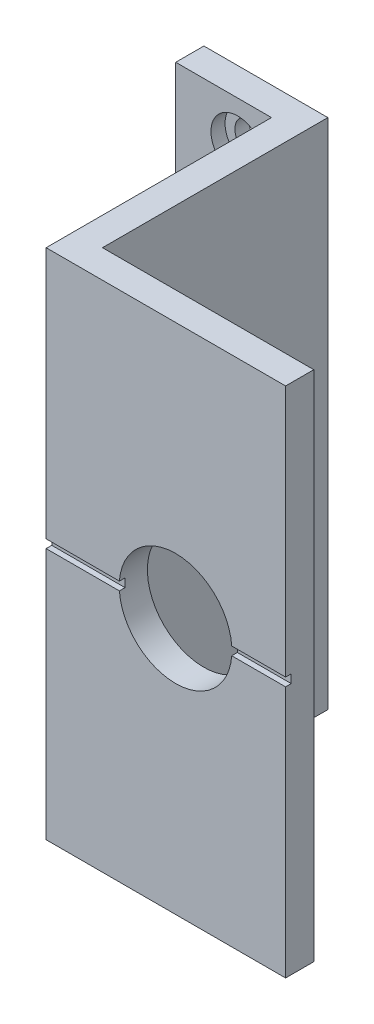
ISO-10303-21;
HEADER;
FILE_DESCRIPTION(('STEP AP214'),'2;1');
FILE_NAME('part.step','',(''),(''),'','','');
FILE_SCHEMA(('AUTOMOTIVE_DESIGN { 1 0 10303 214 1 1 1 1 }'));
ENDSEC;
DATA;
#1=APPLICATION_CONTEXT('core data for automotive mechanical design processes');
#2=APPLICATION_PROTOCOL_DEFINITION('international standard','automotive_design',2000,#1);
#3=PRODUCT_CONTEXT('',#1,'mechanical');
#4=PRODUCT('Part','Part','',(#3));
#5=PRODUCT_RELATED_PRODUCT_CATEGORY('part','',(#4));
#6=PRODUCT_DEFINITION_FORMATION('','',#4);
#7=PRODUCT_DEFINITION_CONTEXT('part definition',#1,'design');
#8=PRODUCT_DEFINITION('design','',#6,#7);
#9=PRODUCT_DEFINITION_SHAPE('','',#8);
#10=(LENGTH_UNIT() NAMED_UNIT(*) SI_UNIT(.MILLI.,.METRE.));
#11=(NAMED_UNIT(*) PLANE_ANGLE_UNIT() SI_UNIT($,.RADIAN.));
#12=(NAMED_UNIT(*) SI_UNIT($,.STERADIAN.) SOLID_ANGLE_UNIT());
#13=UNCERTAINTY_MEASURE_WITH_UNIT(LENGTH_MEASURE(1.E-05),#10,'distance_accuracy_value','');
#14=(GEOMETRIC_REPRESENTATION_CONTEXT(3) GLOBAL_UNCERTAINTY_ASSIGNED_CONTEXT((#13)) GLOBAL_UNIT_ASSIGNED_CONTEXT((#10,
#11,#12)) REPRESENTATION_CONTEXT('',''));
#15=CARTESIAN_POINT('',(0.,0.,0.));
#16=DIRECTION('',(0.,0.,1.));
#17=DIRECTION('',(1.,0.,0.));
#18=AXIS2_PLACEMENT_3D('',#15,#16,#17);
#19=CARTESIAN_POINT('',(1.26077145221769,16.9859730706249,1.));
#20=DIRECTION('',(1.,0.,0.));
#21=DIRECTION('',(0.,1.,0.));
#22=AXIS2_PLACEMENT_3D('',#19,#20,#21);
#23=PLANE('',#22);
#24=DIRECTION('',(0.,-1.,0.));
#25=VECTOR('',#24,1.);
#26=CARTESIAN_POINT('',(1.26077145221769,16.9859730706249,1.));
#27=LINE('',#26,#25);
#28=CARTESIAN_POINT('',(1.26077145221769,5.23597307062491,1.));
#29=VERTEX_POINT('',#28);
#30=CARTESIAN_POINT('',(1.26077145221769,-1.21402692937509,1.));
#31=VERTEX_POINT('',#30);
#32=EDGE_CURVE('E204',#29,#31,#27,.T.);
#33=ORIENTED_EDGE('',*,*,#32,.F.);
#34=DIRECTION('',(0.,0.,1.));
#35=VECTOR('',#34,1.);
#36=CARTESIAN_POINT('',(1.26077145221769,5.23597307062491,1.));
#37=LINE('',#36,#35);
#38=CARTESIAN_POINT('',(1.26077145221769,5.23597307062491,0.));
#39=VERTEX_POINT('',#38);
#40=EDGE_CURVE('E195',#39,#29,#37,.T.);
#41=ORIENTED_EDGE('',*,*,#40,.F.);
#42=DIRECTION('',(0.,-1.,0.));
#43=VECTOR('',#42,1.);
#44=CARTESIAN_POINT('',(1.26077145221769,16.9859730706249,0.));
#45=LINE('',#44,#43);
#46=CARTESIAN_POINT('',(1.26077145221769,-1.21402692937509,0.));
#47=VERTEX_POINT('',#46);
#48=EDGE_CURVE('E216',#39,#47,#45,.T.);
#49=ORIENTED_EDGE('',*,*,#48,.T.);
#50=DIRECTION('',(0.,0.,-1.));
#51=VECTOR('',#50,1.);
#52=CARTESIAN_POINT('',(1.26077145221769,-1.21402692937509,1.));
#53=LINE('',#52,#51);
#54=EDGE_CURVE('E228',#31,#47,#53,.T.);
#55=ORIENTED_EDGE('',*,*,#54,.F.);
#56=EDGE_LOOP('',(#33,#41,#49,#55));
#57=FACE_BOUND('',#56,.T.);
#58=ADVANCED_FACE('F32',(#57),#23,.F.);
#59=CARTESIAN_POINT('',(0.,0.,9.));
#60=DIRECTION('',(0.,0.,1.));
#61=DIRECTION('',(1.,0.,0.));
#62=AXIS2_PLACEMENT_3D('',#59,#60,#61);
#63=PLANE('',#62);
#64=DIRECTION('',(-1.,0.,0.));
#65=VECTOR('',#64,1.);
#66=CARTESIAN_POINT('',(4.66077145221769,8.03597307062482,9.));
#67=LINE('',#66,#65);
#68=CARTESIAN_POINT('',(13.1607714522177,8.03597307062483,9.));
#69=VERTEX_POINT('',#68);
#70=CARTESIAN_POINT('',(11.2492126650431,8.03597307062483,9.));
#71=VERTEX_POINT('',#70);
#72=EDGE_CURVE('E315',#69,#71,#67,.T.);
#73=ORIENTED_EDGE('',*,*,#72,.F.);
#74=DIRECTION('',(0.,1.,0.));
#75=VECTOR('',#74,1.);
#76=CARTESIAN_POINT('',(13.1607714522177,16.9859730706248,9.));
#77=LINE('',#76,#75);
#78=CARTESIAN_POINT('',(13.1607714522177,16.9859730706248,9.));
#79=VERTEX_POINT('',#78);
#80=EDGE_CURVE('E351',#69,#79,#77,.T.);
#81=ORIENTED_EDGE('',*,*,#80,.T.);
#82=DIRECTION('',(-1.,0.,0.));
#83=VECTOR('',#82,1.);
#84=CARTESIAN_POINT('',(4.66077145221769,16.9859730706249,9.));
#85=LINE('',#84,#83);
#86=CARTESIAN_POINT('',(4.66077145221769,16.9859730706249,9.));
#87=VERTEX_POINT('',#86);
#88=EDGE_CURVE('E355',#79,#87,#85,.T.);
#89=ORIENTED_EDGE('',*,*,#88,.T.);
#90=DIRECTION('',(0.,-1.,0.));
#91=VECTOR('',#90,1.);
#92=CARTESIAN_POINT('',(4.66077145221769,16.9859730706249,9.));
#93=LINE('',#92,#91);
#94=CARTESIAN_POINT('',(4.66077145221769,8.03597307062482,9.));
#95=VERTEX_POINT('',#94);
#96=EDGE_CURVE('E345',#87,#95,#93,.T.);
#97=ORIENTED_EDGE('',*,*,#96,.T.);
#98=CARTESIAN_POINT('',(7.26047853000731,8.03597307062483,9.));
#99=VERTEX_POINT('',#98);
#100=EDGE_CURVE('E326',#99,#95,#67,.T.);
#101=ORIENTED_EDGE('',*,*,#100,.F.);
#102=CARTESIAN_POINT('',(9.25484559752519,7.88597307062491,9.));
#103=DIRECTION('',(0.,0.,1.));
#104=DIRECTION('',(1.,0.,0.));
#105=AXIS2_PLACEMENT_3D('',#102,#103,#104);
#106=CIRCLE('',#105,1.99999999999996);
#107=EDGE_CURVE('E338',#71,#99,#106,.T.);
#108=ORIENTED_EDGE('',*,*,#107,.F.);
#109=EDGE_LOOP('',(#73,#81,#89,#97,#101,#108));
#110=FACE_BOUND('',#109,.T.);
#111=ADVANCED_FACE('F429',(#110),#63,.T.);
#112=CARTESIAN_POINT('',(1.26077145221769,16.9859730706249,0.));
#113=VERTEX_POINT('',#112);
#114=CARTESIAN_POINT('',(1.26077145221769,10.5359730706249,0.));
#115=VERTEX_POINT('',#114);
#116=EDGE_CURVE('E194',#113,#115,#45,.T.);
#117=ORIENTED_EDGE('',*,*,#116,.T.);
#118=DIRECTION('',(0.,0.,-1.));
#119=VECTOR('',#118,1.);
#120=CARTESIAN_POINT('',(1.26077145221769,10.5359730706249,0.));
#121=LINE('',#120,#119);
#122=CARTESIAN_POINT('',(1.26077145221769,10.5359730706249,1.));
#123=VERTEX_POINT('',#122);
#124=EDGE_CURVE('E180',#123,#115,#121,.T.);
#125=ORIENTED_EDGE('',*,*,#124,.F.);
#126=CARTESIAN_POINT('',(1.26077145221769,16.9859730706249,1.));
#127=VERTEX_POINT('',#126);
#128=EDGE_CURVE('E192',#127,#123,#27,.T.);
#129=ORIENTED_EDGE('',*,*,#128,.F.);
#130=DIRECTION('',(0.,0.,-1.));
#131=VECTOR('',#130,1.);
#132=CARTESIAN_POINT('',(1.26077145221769,16.9859730706249,1.));
#133=LINE('',#132,#131);
#134=EDGE_CURVE('E213',#127,#113,#133,.T.);
#135=ORIENTED_EDGE('',*,*,#134,.T.);
#136=EDGE_LOOP('',(#117,#125,#129,#135));
#137=FACE_BOUND('',#136,.T.);
#138=ADVANCED_FACE('F190',(#137),#23,.F.);
#139=CARTESIAN_POINT('',(1.26077145221769,-1.21402692937509,1.));
#140=DIRECTION('',(0.,1.,0.));
#141=DIRECTION('',(0.,0.,1.));
#142=AXIS2_PLACEMENT_3D('',#139,#140,#141);
#143=PLANE('',#142);
#144=DIRECTION('',(1.,0.,0.));
#145=VECTOR('',#144,1.);
#146=CARTESIAN_POINT('',(1.26077145221769,-1.21402692937509,0.));
#147=LINE('',#146,#145);
#148=CARTESIAN_POINT('',(5.66077145221769,-1.21402692937509,0.));
#149=VERTEX_POINT('',#148);
#150=EDGE_CURVE('E215',#47,#149,#147,.T.);
#151=ORIENTED_EDGE('',*,*,#150,.T.);
#152=DIRECTION('',(0.,0.,-1.));
#153=VECTOR('',#152,1.);
#154=CARTESIAN_POINT('',(5.66077145221769,-1.21402692937509,1.));
#155=LINE('',#154,#153);
#156=CARTESIAN_POINT('',(5.66077145221769,-1.21402692937509,8.));
#157=VERTEX_POINT('',#156);
#158=EDGE_CURVE('E225',#157,#149,#155,.T.);
#159=ORIENTED_EDGE('',*,*,#158,.F.);
#160=DIRECTION('',(1.,0.,0.));
#161=VECTOR('',#160,1.);
#162=CARTESIAN_POINT('',(4.66077145221769,-1.21402692937509,8.));
#163=LINE('',#162,#161);
#164=CARTESIAN_POINT('',(13.1607714522177,-1.21402692937517,8.));
#165=VERTEX_POINT('',#164);
#166=EDGE_CURVE('E341',#157,#165,#163,.T.);
#167=ORIENTED_EDGE('',*,*,#166,.T.);
#168=DIRECTION('',(0.,0.,-1.));
#169=VECTOR('',#168,1.);
#170=CARTESIAN_POINT('',(13.1607714522177,-1.21402692937517,9.));
#171=LINE('',#170,#169);
#172=CARTESIAN_POINT('',(13.1607714522177,-1.21402692937517,9.));
#173=VERTEX_POINT('',#172);
#174=EDGE_CURVE('E367',#173,#165,#171,.T.);
#175=ORIENTED_EDGE('',*,*,#174,.F.);
#176=DIRECTION('',(1.,0.,0.));
#177=VECTOR('',#176,1.);
#178=CARTESIAN_POINT('',(4.66077145221769,-1.21402692937509,9.));
#179=LINE('',#178,#177);
#180=CARTESIAN_POINT('',(4.66077145221769,-1.21402692937509,9.));
#181=VERTEX_POINT('',#180);
#182=EDGE_CURVE('E348',#181,#173,#179,.T.);
#183=ORIENTED_EDGE('',*,*,#182,.F.);
#184=DIRECTION('',(0.,0.,-1.));
#185=VECTOR('',#184,1.);
#186=CARTESIAN_POINT('',(4.6607714522177,-1.21402692937509,8.));
#187=LINE('',#186,#185);
#188=CARTESIAN_POINT('',(4.6607714522177,-1.21402692937509,1.));
#189=VERTEX_POINT('',#188);
#190=EDGE_CURVE('E379',#181,#189,#187,.T.);
#191=ORIENTED_EDGE('',*,*,#190,.T.);
#192=DIRECTION('',(1.,0.,0.));
#193=VECTOR('',#192,1.);
#194=CARTESIAN_POINT('',(1.26077145221769,-1.21402692937509,1.));
#195=LINE('',#194,#193);
#196=EDGE_CURVE('E203',#31,#189,#195,.T.);
#197=ORIENTED_EDGE('',*,*,#196,.F.);
#198=ORIENTED_EDGE('',*,*,#54,.T.);
#199=EDGE_LOOP('',(#151,#159,#167,#175,#183,#191,#197,#198));
#200=FACE_BOUND('',#199,.T.);
#201=ADVANCED_FACE('F440',(#200),#143,.F.);
#202=CARTESIAN_POINT('',(5.66077145221769,16.9859730706249,1.));
#203=DIRECTION('',(-1.,0.,0.));
#204=DIRECTION('',(0.,-1.,0.));
#205=AXIS2_PLACEMENT_3D('',#202,#203,#204);
#206=PLANE('',#205);
#207=DIRECTION('',(0.,1.,0.));
#208=VECTOR('',#207,1.);
#209=CARTESIAN_POINT('',(5.66077145221769,16.9859730706249,0.));
#210=LINE('',#209,#208);
#211=CARTESIAN_POINT('',(5.66077145221769,16.9859730706249,0.));
#212=VERTEX_POINT('',#211);
#213=EDGE_CURVE('E218',#149,#212,#210,.T.);
#214=ORIENTED_EDGE('',*,*,#213,.T.);
#215=DIRECTION('',(0.,0.,-1.));
#216=VECTOR('',#215,1.);
#217=CARTESIAN_POINT('',(5.66077145221769,16.9859730706249,1.));
#218=LINE('',#217,#216);
#219=CARTESIAN_POINT('',(5.66077145221769,16.9859730706249,8.));
#220=VERTEX_POINT('',#219);
#221=EDGE_CURVE('E222',#220,#212,#218,.T.);
#222=ORIENTED_EDGE('',*,*,#221,.F.);
#223=DIRECTION('',(0.,1.,0.));
#224=VECTOR('',#223,1.);
#225=CARTESIAN_POINT('',(5.66077145221769,16.9859730706249,8.));
#226=LINE('',#225,#224);
#227=EDGE_CURVE('E371',#157,#220,#226,.T.);
#228=ORIENTED_EDGE('',*,*,#227,.F.);
#229=ORIENTED_EDGE('',*,*,#158,.T.);
#230=EDGE_LOOP('',(#214,#222,#228,#229));
#231=FACE_BOUND('',#230,.T.);
#232=ADVANCED_FACE('F444',(#231),#206,.F.);
#233=CARTESIAN_POINT('',(1.26077145221769,16.9859730706249,1.));
#234=DIRECTION('',(0.,-1.,0.));
#235=DIRECTION('',(0.,0.,-1.));
#236=AXIS2_PLACEMENT_3D('',#233,#234,#235);
#237=PLANE('',#236);
#238=DIRECTION('',(-1.,0.,0.));
#239=VECTOR('',#238,1.);
#240=CARTESIAN_POINT('',(1.26077145221769,16.9859730706249,0.));
#241=LINE('',#240,#239);
#242=EDGE_CURVE('E207',#212,#113,#241,.T.);
#243=ORIENTED_EDGE('',*,*,#242,.T.);
#244=ORIENTED_EDGE('',*,*,#134,.F.);
#245=DIRECTION('',(-1.,0.,0.));
#246=VECTOR('',#245,1.);
#247=CARTESIAN_POINT('',(1.26077145221769,16.9859730706249,1.));
#248=LINE('',#247,#246);
#249=CARTESIAN_POINT('',(4.66077145221769,16.9859730706249,1.));
#250=VERTEX_POINT('',#249);
#251=EDGE_CURVE('E201',#250,#127,#248,.T.);
#252=ORIENTED_EDGE('',*,*,#251,.F.);
#253=DIRECTION('',(0.,0.,-1.));
#254=VECTOR('',#253,1.);
#255=CARTESIAN_POINT('',(4.66077145221769,16.9859730706249,8.));
#256=LINE('',#255,#254);
#257=EDGE_CURVE('E374',#87,#250,#256,.T.);
#258=ORIENTED_EDGE('',*,*,#257,.F.);
#259=ORIENTED_EDGE('',*,*,#88,.F.);
#260=DIRECTION('',(0.,0.,-1.));
#261=VECTOR('',#260,1.);
#262=CARTESIAN_POINT('',(13.1607714522177,16.9859730706248,9.));
#263=LINE('',#262,#261);
#264=CARTESIAN_POINT('',(13.1607714522177,16.9859730706248,8.));
#265=VERTEX_POINT('',#264);
#266=EDGE_CURVE('E358',#79,#265,#263,.T.);
#267=ORIENTED_EDGE('',*,*,#266,.T.);
#268=DIRECTION('',(-1.,0.,0.));
#269=VECTOR('',#268,1.);
#270=CARTESIAN_POINT('',(4.66077145221769,16.9859730706249,8.));
#271=LINE('',#270,#269);
#272=EDGE_CURVE('E362',#265,#220,#271,.T.);
#273=ORIENTED_EDGE('',*,*,#272,.T.);
#274=ORIENTED_EDGE('',*,*,#221,.T.);
#275=EDGE_LOOP('',(#243,#244,#252,#258,#259,#267,#273,#274));
#276=FACE_BOUND('',#275,.T.);
#277=ADVANCED_FACE('F410',(#276),#237,.F.);
#278=CARTESIAN_POINT('',(0.,0.,1.));
#279=DIRECTION('',(0.,0.,1.));
#280=DIRECTION('',(1.,0.,0.));
#281=AXIS2_PLACEMENT_3D('',#278,#279,#280);
#282=PLANE('',#281);
#283=DIRECTION('',(0.,1.,0.));
#284=VECTOR('',#283,1.);
#285=CARTESIAN_POINT('',(3.26077145221769,10.5359730706249,1.));
#286=LINE('',#285,#284);
#287=CARTESIAN_POINT('',(3.26077145221769,5.73597307062491,1.));
#288=VERTEX_POINT('',#287);
#289=CARTESIAN_POINT('',(3.26077145221769,10.0359730706249,1.));
#290=VERTEX_POINT('',#289);
#291=EDGE_CURVE('E271',#288,#290,#286,.T.);
#292=ORIENTED_EDGE('',*,*,#291,.F.);
#293=CARTESIAN_POINT('',(2.76077145221769,5.73597307062491,1.));
#294=DIRECTION('',(0.,0.,1.));
#295=DIRECTION('',(1.,0.,0.));
#296=AXIS2_PLACEMENT_3D('',#293,#294,#295);
#297=CIRCLE('',#296,0.5);
#298=CARTESIAN_POINT('',(2.76077145221769,5.23597307062491,1.));
#299=VERTEX_POINT('',#298);
#300=EDGE_CURVE('E254',#288,#299,#297,.F.);
#301=ORIENTED_EDGE('',*,*,#300,.T.);
#302=DIRECTION('',(-1.,0.,0.));
#303=VECTOR('',#302,1.);
#304=CARTESIAN_POINT('',(3.26077145221769,5.23597307062491,1.));
#305=LINE('',#304,#303);
#306=EDGE_CURVE('E275',#299,#29,#305,.T.);
#307=ORIENTED_EDGE('',*,*,#306,.T.);
#308=ORIENTED_EDGE('',*,*,#32,.T.);
#309=ORIENTED_EDGE('',*,*,#196,.T.);
#310=DIRECTION('',(0.,-1.,0.));
#311=VECTOR('',#310,1.);
#312=CARTESIAN_POINT('',(4.66077145221769,16.9859730706249,1.));
#313=LINE('',#312,#311);
#314=EDGE_CURVE('E370',#250,#189,#313,.T.);
#315=ORIENTED_EDGE('',*,*,#314,.F.);
#316=ORIENTED_EDGE('',*,*,#251,.T.);
#317=ORIENTED_EDGE('',*,*,#128,.T.);
#318=DIRECTION('',(-1.,0.,0.));
#319=VECTOR('',#318,1.);
#320=CARTESIAN_POINT('',(3.26077145221769,10.5359730706249,1.));
#321=LINE('',#320,#319);
#322=CARTESIAN_POINT('',(2.76077145221769,10.5359730706249,1.));
#323=VERTEX_POINT('',#322);
#324=EDGE_CURVE('E177',#323,#123,#321,.T.);
#325=ORIENTED_EDGE('',*,*,#324,.F.);
#326=CARTESIAN_POINT('',(2.76077145221769,10.0359730706249,1.));
#327=DIRECTION('',(0.,0.,1.));
#328=DIRECTION('',(1.,0.,0.));
#329=AXIS2_PLACEMENT_3D('',#326,#327,#328);
#330=CIRCLE('',#329,0.5);
#331=EDGE_CURVE('E11',#323,#290,#330,.F.);
#332=ORIENTED_EDGE('',*,*,#331,.T.);
#333=EDGE_LOOP('',(#292,#301,#307,#308,#309,#315,#316,#317,#325,#332));
#334=FACE_BOUND('',#333,.T.);
#335=CARTESIAN_POINT('',(3.46077145221769,15.4859730706249,1.));
#336=DIRECTION('',(0.,0.,1.));
#337=DIRECTION('',(1.,0.,0.));
#338=AXIS2_PLACEMENT_3D('',#335,#336,#337);
#339=CIRCLE('',#338,0.950000000000001);
#340=CARTESIAN_POINT('',(4.41077145221769,15.4859730706249,1.));
#341=VERTEX_POINT('',#340);
#342=EDGE_CURVE('E386',#341,#341,#339,.T.);
#343=ORIENTED_EDGE('',*,*,#342,.F.);
#344=EDGE_LOOP('',(#343));
#345=FACE_BOUND('',#344,.T.);
#346=CARTESIAN_POINT('',(3.46077145221769,2.78597307062491,1.));
#347=DIRECTION('',(0.,0.,1.));
#348=DIRECTION('',(1.,0.,0.));
#349=AXIS2_PLACEMENT_3D('',#346,#347,#348);
#350=CIRCLE('',#349,0.95);
#351=CARTESIAN_POINT('',(4.41077145221769,2.78597307062491,1.));
#352=VERTEX_POINT('',#351);
#353=EDGE_CURVE('E382',#352,#352,#350,.T.);
#354=ORIENTED_EDGE('',*,*,#353,.F.);
#355=EDGE_LOOP('',(#354));
#356=FACE_BOUND('',#355,.T.);
#357=CARTESIAN_POINT('',(3.46077145221769,12.9859730706249,1.));
#358=DIRECTION('',(0.,0.,1.));
#359=DIRECTION('',(1.,0.,0.));
#360=AXIS2_PLACEMENT_3D('',#357,#358,#359);
#361=CIRCLE('',#360,0.949999999999999);
#362=CARTESIAN_POINT('',(4.41077145221769,12.9859730706249,1.));
#363=VERTEX_POINT('',#362);
#364=EDGE_CURVE('E209',#363,#363,#361,.T.);
#365=ORIENTED_EDGE('',*,*,#364,.F.);
#366=EDGE_LOOP('',(#365));
#367=FACE_BOUND('',#366,.T.);
#368=CARTESIAN_POINT('',(3.46077145221769,0.285973070624914,1.));
#369=DIRECTION('',(0.,0.,1.));
#370=DIRECTION('',(1.,0.,0.));
#371=AXIS2_PLACEMENT_3D('',#368,#369,#370);
#372=CIRCLE('',#371,0.95);
#373=CARTESIAN_POINT('',(4.41077145221769,0.285973070624914,1.));
#374=VERTEX_POINT('',#373);
#375=EDGE_CURVE('E397',#374,#374,#372,.T.);
#376=ORIENTED_EDGE('',*,*,#375,.F.);
#377=EDGE_LOOP('',(#376));
#378=FACE_BOUND('',#377,.T.);
#379=ADVANCED_FACE('F198',(#334,#345,#356,#367,#378),#282,.T.);
#380=CARTESIAN_POINT('',(0.,0.,0.));
#381=DIRECTION('',(0.,0.,1.));
#382=DIRECTION('',(1.,0.,0.));
#383=AXIS2_PLACEMENT_3D('',#380,#381,#382);
#384=PLANE('',#383);
#385=ORIENTED_EDGE('',*,*,#48,.F.);
#386=DIRECTION('',(-1.,0.,0.));
#387=VECTOR('',#386,1.);
#388=CARTESIAN_POINT('',(3.26077145221769,5.23597307062491,0.));
#389=LINE('',#388,#387);
#390=CARTESIAN_POINT('',(2.76077145221769,5.23597307062491,0.));
#391=VERTEX_POINT('',#390);
#392=EDGE_CURVE('E263',#391,#39,#389,.T.);
#393=ORIENTED_EDGE('',*,*,#392,.F.);
#394=CARTESIAN_POINT('',(2.76077145221769,5.73597307062491,0.));
#395=DIRECTION('',(0.,0.,1.));
#396=DIRECTION('',(1.,0.,0.));
#397=AXIS2_PLACEMENT_3D('',#394,#395,#396);
#398=CIRCLE('',#397,0.5);
#399=CARTESIAN_POINT('',(3.26077145221769,5.73597307062491,0.));
#400=VERTEX_POINT('',#399);
#401=EDGE_CURVE('E256',#391,#400,#398,.T.);
#402=ORIENTED_EDGE('',*,*,#401,.T.);
#403=DIRECTION('',(0.,-1.,0.));
#404=VECTOR('',#403,1.);
#405=CARTESIAN_POINT('',(3.26077145221769,10.5359730706249,0.));
#406=LINE('',#405,#404);
#407=CARTESIAN_POINT('',(3.26077145221769,10.0359730706249,0.));
#408=VERTEX_POINT('',#407);
#409=EDGE_CURVE('E186',#408,#400,#406,.T.);
#410=ORIENTED_EDGE('',*,*,#409,.F.);
#411=CARTESIAN_POINT('',(2.76077145221769,10.0359730706249,0.));
#412=DIRECTION('',(0.,0.,1.));
#413=DIRECTION('',(1.,0.,0.));
#414=AXIS2_PLACEMENT_3D('',#411,#412,#413);
#415=CIRCLE('',#414,0.5);
#416=CARTESIAN_POINT('',(2.76077145221769,10.5359730706249,0.));
#417=VERTEX_POINT('',#416);
#418=EDGE_CURVE('E40',#408,#417,#415,.T.);
#419=ORIENTED_EDGE('',*,*,#418,.T.);
#420=DIRECTION('',(-1.,0.,0.));
#421=VECTOR('',#420,1.);
#422=CARTESIAN_POINT('',(3.26077145221769,10.5359730706249,0.));
#423=LINE('',#422,#421);
#424=EDGE_CURVE('E185',#417,#115,#423,.T.);
#425=ORIENTED_EDGE('',*,*,#424,.T.);
#426=ORIENTED_EDGE('',*,*,#116,.F.);
#427=ORIENTED_EDGE('',*,*,#242,.F.);
#428=ORIENTED_EDGE('',*,*,#213,.F.);
#429=ORIENTED_EDGE('',*,*,#150,.F.);
#430=EDGE_LOOP('',(#385,#393,#402,#410,#419,#425,#426,#427,#428,#429));
#431=FACE_BOUND('',#430,.T.);
#432=CARTESIAN_POINT('',(3.46077145221769,15.4859730706249,0.));
#433=DIRECTION('',(0.,0.,1.));
#434=DIRECTION('',(1.,0.,0.));
#435=AXIS2_PLACEMENT_3D('',#432,#433,#434);
#436=CIRCLE('',#435,0.600000000000001);
#437=CARTESIAN_POINT('',(4.06077145221769,15.4859730706249,0.));
#438=VERTEX_POINT('',#437);
#439=EDGE_CURVE('E290',#438,#438,#436,.T.);
#440=ORIENTED_EDGE('',*,*,#439,.T.);
#441=EDGE_LOOP('',(#440));
#442=FACE_BOUND('',#441,.T.);
#443=CARTESIAN_POINT('',(3.46077145221769,12.9859730706249,0.));
#444=DIRECTION('',(0.,0.,1.));
#445=DIRECTION('',(1.,0.,0.));
#446=AXIS2_PLACEMENT_3D('',#443,#444,#445);
#447=CIRCLE('',#446,0.6);
#448=CARTESIAN_POINT('',(4.06077145221769,12.9859730706249,0.));
#449=VERTEX_POINT('',#448);
#450=EDGE_CURVE('E297',#449,#449,#447,.T.);
#451=ORIENTED_EDGE('',*,*,#450,.T.);
#452=EDGE_LOOP('',(#451));
#453=FACE_BOUND('',#452,.T.);
#454=CARTESIAN_POINT('',(3.46077145221769,2.78597307062491,0.));
#455=DIRECTION('',(0.,0.,1.));
#456=DIRECTION('',(1.,0.,0.));
#457=AXIS2_PLACEMENT_3D('',#454,#455,#456);
#458=CIRCLE('',#457,0.6);
#459=CARTESIAN_POINT('',(4.06077145221769,2.78597307062491,0.));
#460=VERTEX_POINT('',#459);
#461=EDGE_CURVE('E303',#460,#460,#458,.T.);
#462=ORIENTED_EDGE('',*,*,#461,.T.);
#463=EDGE_LOOP('',(#462));
#464=FACE_BOUND('',#463,.T.);
#465=CARTESIAN_POINT('',(3.46077145221769,0.285973070624914,0.));
#466=DIRECTION('',(0.,0.,1.));
#467=DIRECTION('',(1.,0.,0.));
#468=AXIS2_PLACEMENT_3D('',#465,#466,#467);
#469=CIRCLE('',#468,0.6);
#470=CARTESIAN_POINT('',(4.06077145221769,0.285973070624914,0.));
#471=VERTEX_POINT('',#470);
#472=EDGE_CURVE('E284',#471,#471,#469,.T.);
#473=ORIENTED_EDGE('',*,*,#472,.T.);
#474=EDGE_LOOP('',(#473));
#475=FACE_BOUND('',#474,.T.);
#476=ADVANCED_FACE('F261',(#431,#442,#453,#464,#475),#384,.F.);
#477=CARTESIAN_POINT('',(3.46077145221769,0.285973070624914,0.5));
#478=DIRECTION('',(0.,0.,1.));
#479=DIRECTION('',(1.,0.,0.));
#480=AXIS2_PLACEMENT_3D('',#477,#478,#479);
#481=CYLINDRICAL_SURFACE('',#480,0.95);
#482=CARTESIAN_POINT('',(3.46077145221769,0.285973070624914,0.5));
#483=DIRECTION('',(0.,0.,1.));
#484=DIRECTION('',(1.,0.,0.));
#485=AXIS2_PLACEMENT_3D('',#482,#483,#484);
#486=CIRCLE('',#485,0.95);
#487=CARTESIAN_POINT('',(4.41077145221769,0.285973070624914,0.5));
#488=VERTEX_POINT('',#487);
#489=EDGE_CURVE('E389',#488,#488,#486,.T.);
#490=ORIENTED_EDGE('',*,*,#489,.F.);
#491=EDGE_LOOP('',(#490));
#492=FACE_BOUND('',#491,.T.);
#493=ORIENTED_EDGE('',*,*,#375,.T.);
#494=EDGE_LOOP('',(#493));
#495=FACE_BOUND('',#494,.T.);
#496=ADVANCED_FACE('F414',(#492,#495),#481,.F.);
#497=CARTESIAN_POINT('',(3.46077145221769,0.285973070624914,0.5));
#498=DIRECTION('',(0.,0.,1.));
#499=DIRECTION('',(1.,0.,0.));
#500=AXIS2_PLACEMENT_3D('',#497,#498,#499);
#501=PLANE('',#500);
#502=CARTESIAN_POINT('',(3.46077145221769,0.285973070624914,0.5));
#503=DIRECTION('',(0.,0.,1.));
#504=DIRECTION('',(1.,0.,0.));
#505=AXIS2_PLACEMENT_3D('',#502,#503,#504);
#506=CIRCLE('',#505,0.6);
#507=CARTESIAN_POINT('',(4.06077145221769,0.285973070624914,0.5));
#508=VERTEX_POINT('',#507);
#509=EDGE_CURVE('E281',#508,#508,#506,.T.);
#510=ORIENTED_EDGE('',*,*,#509,.F.);
#511=EDGE_LOOP('',(#510));
#512=FACE_BOUND('',#511,.T.);
#513=ORIENTED_EDGE('',*,*,#489,.T.);
#514=EDGE_LOOP('',(#513));
#515=FACE_BOUND('',#514,.T.);
#516=ADVANCED_FACE('F416',(#512,#515),#501,.T.);
#517=CARTESIAN_POINT('',(3.46077145221769,12.9859730706249,0.5));
#518=DIRECTION('',(0.,0.,1.));
#519=DIRECTION('',(1.,0.,0.));
#520=AXIS2_PLACEMENT_3D('',#517,#518,#519);
#521=CYLINDRICAL_SURFACE('',#520,0.949999999999999);
#522=CARTESIAN_POINT('',(3.46077145221769,12.9859730706249,0.5));
#523=DIRECTION('',(0.,0.,1.));
#524=DIRECTION('',(1.,0.,0.));
#525=AXIS2_PLACEMENT_3D('',#522,#523,#524);
#526=CIRCLE('',#525,0.949999999999999);
#527=CARTESIAN_POINT('',(4.41077145221769,12.9859730706249,0.5));
#528=VERTEX_POINT('',#527);
#529=EDGE_CURVE('E399',#528,#528,#526,.T.);
#530=ORIENTED_EDGE('',*,*,#529,.F.);
#531=EDGE_LOOP('',(#530));
#532=FACE_BOUND('',#531,.T.);
#533=ORIENTED_EDGE('',*,*,#364,.T.);
#534=EDGE_LOOP('',(#533));
#535=FACE_BOUND('',#534,.T.);
#536=ADVANCED_FACE('F406',(#532,#535),#521,.F.);
#537=CARTESIAN_POINT('',(3.46077145221769,12.9859730706249,0.5));
#538=DIRECTION('',(0.,0.,1.));
#539=DIRECTION('',(1.,0.,0.));
#540=AXIS2_PLACEMENT_3D('',#537,#538,#539);
#541=PLANE('',#540);
#542=CARTESIAN_POINT('',(3.46077145221769,12.9859730706249,0.5));
#543=DIRECTION('',(0.,0.,1.));
#544=DIRECTION('',(1.,0.,0.));
#545=AXIS2_PLACEMENT_3D('',#542,#543,#544);
#546=CIRCLE('',#545,0.6);
#547=CARTESIAN_POINT('',(4.06077145221769,12.9859730706249,0.5));
#548=VERTEX_POINT('',#547);
#549=EDGE_CURVE('E300',#548,#548,#546,.T.);
#550=ORIENTED_EDGE('',*,*,#549,.F.);
#551=EDGE_LOOP('',(#550));
#552=FACE_BOUND('',#551,.T.);
#553=ORIENTED_EDGE('',*,*,#529,.T.);
#554=EDGE_LOOP('',(#553));
#555=FACE_BOUND('',#554,.T.);
#556=ADVANCED_FACE('F456',(#552,#555),#541,.T.);
#557=CARTESIAN_POINT('',(3.46077145221769,2.78597307062491,0.5));
#558=DIRECTION('',(0.,0.,1.));
#559=DIRECTION('',(1.,0.,0.));
#560=AXIS2_PLACEMENT_3D('',#557,#558,#559);
#561=CYLINDRICAL_SURFACE('',#560,0.95);
#562=CARTESIAN_POINT('',(3.46077145221769,2.78597307062491,0.5));
#563=DIRECTION('',(0.,0.,1.));
#564=DIRECTION('',(1.,0.,0.));
#565=AXIS2_PLACEMENT_3D('',#562,#563,#564);
#566=CIRCLE('',#565,0.95);
#567=CARTESIAN_POINT('',(4.41077145221769,2.78597307062491,0.5));
#568=VERTEX_POINT('',#567);
#569=EDGE_CURVE('E390',#568,#568,#566,.T.);
#570=ORIENTED_EDGE('',*,*,#569,.F.);
#571=EDGE_LOOP('',(#570));
#572=FACE_BOUND('',#571,.T.);
#573=ORIENTED_EDGE('',*,*,#353,.T.);
#574=EDGE_LOOP('',(#573));
#575=FACE_BOUND('',#574,.T.);
#576=ADVANCED_FACE('F459',(#572,#575),#561,.F.);
#577=CARTESIAN_POINT('',(3.46077145221769,2.78597307062491,0.5));
#578=DIRECTION('',(0.,0.,1.));
#579=DIRECTION('',(1.,0.,0.));
#580=AXIS2_PLACEMENT_3D('',#577,#578,#579);
#581=PLANE('',#580);
#582=CARTESIAN_POINT('',(3.46077145221769,2.78597307062491,0.5));
#583=DIRECTION('',(0.,0.,1.));
#584=DIRECTION('',(1.,0.,0.));
#585=AXIS2_PLACEMENT_3D('',#582,#583,#584);
#586=CIRCLE('',#585,0.6);
#587=CARTESIAN_POINT('',(4.06077145221769,2.78597307062491,0.5));
#588=VERTEX_POINT('',#587);
#589=EDGE_CURVE('E306',#588,#588,#586,.T.);
#590=ORIENTED_EDGE('',*,*,#589,.F.);
#591=EDGE_LOOP('',(#590));
#592=FACE_BOUND('',#591,.T.);
#593=ORIENTED_EDGE('',*,*,#569,.T.);
#594=EDGE_LOOP('',(#593));
#595=FACE_BOUND('',#594,.T.);
#596=ADVANCED_FACE('F464',(#592,#595),#581,.T.);
#597=CARTESIAN_POINT('',(3.46077145221769,15.4859730706249,0.5));
#598=DIRECTION('',(0.,0.,1.));
#599=DIRECTION('',(1.,0.,0.));
#600=AXIS2_PLACEMENT_3D('',#597,#598,#599);
#601=CYLINDRICAL_SURFACE('',#600,0.950000000000001);
#602=CARTESIAN_POINT('',(3.46077145221769,15.4859730706249,0.5));
#603=DIRECTION('',(0.,0.,1.));
#604=DIRECTION('',(1.,0.,0.));
#605=AXIS2_PLACEMENT_3D('',#602,#603,#604);
#606=CIRCLE('',#605,0.950000000000001);
#607=CARTESIAN_POINT('',(4.41077145221769,15.4859730706249,0.5));
#608=VERTEX_POINT('',#607);
#609=EDGE_CURVE('E383',#608,#608,#606,.T.);
#610=ORIENTED_EDGE('',*,*,#609,.F.);
#611=EDGE_LOOP('',(#610));
#612=FACE_BOUND('',#611,.T.);
#613=ORIENTED_EDGE('',*,*,#342,.T.);
#614=EDGE_LOOP('',(#613));
#615=FACE_BOUND('',#614,.T.);
#616=ADVANCED_FACE('F526',(#612,#615),#601,.F.);
#617=CARTESIAN_POINT('',(3.46077145221769,15.4859730706249,0.5));
#618=DIRECTION('',(0.,0.,1.));
#619=DIRECTION('',(1.,0.,0.));
#620=AXIS2_PLACEMENT_3D('',#617,#618,#619);
#621=PLANE('',#620);
#622=CARTESIAN_POINT('',(3.46077145221769,15.4859730706249,0.5));
#623=DIRECTION('',(0.,0.,1.));
#624=DIRECTION('',(1.,0.,0.));
#625=AXIS2_PLACEMENT_3D('',#622,#623,#624);
#626=CIRCLE('',#625,0.600000000000001);
#627=CARTESIAN_POINT('',(4.06077145221769,15.4859730706249,0.5));
#628=VERTEX_POINT('',#627);
#629=EDGE_CURVE('E294',#628,#628,#626,.T.);
#630=ORIENTED_EDGE('',*,*,#629,.F.);
#631=EDGE_LOOP('',(#630));
#632=FACE_BOUND('',#631,.T.);
#633=ORIENTED_EDGE('',*,*,#609,.T.);
#634=EDGE_LOOP('',(#633));
#635=FACE_BOUND('',#634,.T.);
#636=ADVANCED_FACE('F522',(#632,#635),#621,.T.);
#637=CARTESIAN_POINT('',(4.66077145221769,16.9859730706249,8.));
#638=DIRECTION('',(1.,0.,0.));
#639=DIRECTION('',(0.,1.,0.));
#640=AXIS2_PLACEMENT_3D('',#637,#638,#639);
#641=PLANE('',#640);
#642=DIRECTION('',(0.,-1.,0.));
#643=VECTOR('',#642,1.);
#644=CARTESIAN_POINT('',(4.66077145221769,8.03597307062482,8.8));
#645=LINE('',#644,#643);
#646=CARTESIAN_POINT('',(4.66077145221769,8.03597307062482,8.8));
#647=VERTEX_POINT('',#646);
#648=CARTESIAN_POINT('',(4.66077145221769,7.73597307062482,8.8));
#649=VERTEX_POINT('',#648);
#650=EDGE_CURVE('E311',#647,#649,#645,.T.);
#651=ORIENTED_EDGE('',*,*,#650,.F.);
#652=DIRECTION('',(0.,0.,1.));
#653=VECTOR('',#652,1.);
#654=CARTESIAN_POINT('',(4.66077145221769,8.03597307062482,8.8));
#655=LINE('',#654,#653);
#656=EDGE_CURVE('E328',#647,#95,#655,.T.);
#657=ORIENTED_EDGE('',*,*,#656,.T.);
#658=ORIENTED_EDGE('',*,*,#96,.F.);
#659=ORIENTED_EDGE('',*,*,#257,.T.);
#660=ORIENTED_EDGE('',*,*,#314,.T.);
#661=ORIENTED_EDGE('',*,*,#190,.F.);
#662=CARTESIAN_POINT('',(4.66077145221769,7.73597307062482,9.));
#663=VERTEX_POINT('',#662);
#664=EDGE_CURVE('E349',#663,#181,#93,.T.);
#665=ORIENTED_EDGE('',*,*,#664,.F.);
#666=DIRECTION('',(0.,0.,1.));
#667=VECTOR('',#666,1.);
#668=CARTESIAN_POINT('',(4.66077145221769,7.73597307062482,8.8));
#669=LINE('',#668,#667);
#670=EDGE_CURVE('E323',#649,#663,#669,.T.);
#671=ORIENTED_EDGE('',*,*,#670,.F.);
#672=EDGE_LOOP('',(#651,#657,#658,#659,#660,#661,#665,#671));
#673=FACE_BOUND('',#672,.T.);
#674=ADVANCED_FACE('F515',(#673),#641,.F.);
#675=CARTESIAN_POINT('',(0.,0.,8.));
#676=DIRECTION('',(0.,0.,1.));
#677=DIRECTION('',(1.,0.,0.));
#678=AXIS2_PLACEMENT_3D('',#675,#676,#677);
#679=PLANE('',#678);
#680=CARTESIAN_POINT('',(9.25484559752519,7.88597307062491,8.));
#681=DIRECTION('',(0.,0.,1.));
#682=DIRECTION('',(1.,0.,0.));
#683=AXIS2_PLACEMENT_3D('',#680,#681,#682);
#684=CIRCLE('',#683,1.99999999999996);
#685=CARTESIAN_POINT('',(11.2548455975251,7.88597307062491,8.));
#686=VERTEX_POINT('',#685);
#687=EDGE_CURVE('E331',#686,#686,#684,.T.);
#688=ORIENTED_EDGE('',*,*,#687,.T.);
#689=EDGE_LOOP('',(#688));
#690=FACE_BOUND('',#689,.T.);
#691=ORIENTED_EDGE('',*,*,#166,.F.);
#692=ORIENTED_EDGE('',*,*,#227,.T.);
#693=ORIENTED_EDGE('',*,*,#272,.F.);
#694=DIRECTION('',(0.,1.,0.));
#695=VECTOR('',#694,1.);
#696=CARTESIAN_POINT('',(13.1607714522177,16.9859730706248,8.));
#697=LINE('',#696,#695);
#698=EDGE_CURVE('E360',#165,#265,#697,.T.);
#699=ORIENTED_EDGE('',*,*,#698,.F.);
#700=EDGE_LOOP('',(#691,#692,#693,#699));
#701=FACE_BOUND('',#700,.T.);
#702=ADVANCED_FACE('F511',(#690,#701),#679,.F.);
#703=DIRECTION('',(1.,0.,0.));
#704=VECTOR('',#703,1.);
#705=CARTESIAN_POINT('',(4.66077145221769,7.73597307062482,9.));
#706=LINE('',#705,#704);
#707=CARTESIAN_POINT('',(7.26047853000732,7.73597307062482,9.));
#708=VERTEX_POINT('',#707);
#709=EDGE_CURVE('E324',#663,#708,#706,.T.);
#710=ORIENTED_EDGE('',*,*,#709,.F.);
#711=ORIENTED_EDGE('',*,*,#664,.T.);
#712=ORIENTED_EDGE('',*,*,#182,.T.);
#713=CARTESIAN_POINT('',(13.1607714522177,7.73597307062482,9.));
#714=VERTEX_POINT('',#713);
#715=EDGE_CURVE('E352',#173,#714,#77,.T.);
#716=ORIENTED_EDGE('',*,*,#715,.T.);
#717=CARTESIAN_POINT('',(11.249212665043,7.73597307062482,9.));
#718=VERTEX_POINT('',#717);
#719=EDGE_CURVE('E293',#718,#714,#706,.T.);
#720=ORIENTED_EDGE('',*,*,#719,.F.);
#721=EDGE_CURVE('E342',#708,#718,#106,.T.);
#722=ORIENTED_EDGE('',*,*,#721,.F.);
#723=EDGE_LOOP('',(#710,#711,#712,#716,#720,#722));
#724=FACE_BOUND('',#723,.T.);
#725=ADVANCED_FACE('F437',(#724),#63,.T.);
#726=CARTESIAN_POINT('',(13.1607714522177,16.9859730706248,9.));
#727=DIRECTION('',(-1.,0.,0.));
#728=DIRECTION('',(0.,0.,1.));
#729=AXIS2_PLACEMENT_3D('',#726,#727,#728);
#730=PLANE('',#729);
#731=ORIENTED_EDGE('',*,*,#80,.F.);
#732=DIRECTION('',(0.,0.,1.));
#733=VECTOR('',#732,1.);
#734=CARTESIAN_POINT('',(13.1607714522177,8.03597307062483,8.8));
#735=LINE('',#734,#733);
#736=CARTESIAN_POINT('',(13.1607714522177,8.03597307062483,8.8));
#737=VERTEX_POINT('',#736);
#738=EDGE_CURVE('E332',#737,#69,#735,.T.);
#739=ORIENTED_EDGE('',*,*,#738,.F.);
#740=DIRECTION('',(0.,1.,0.));
#741=VECTOR('',#740,1.);
#742=CARTESIAN_POINT('',(13.1607714522177,8.03597307062483,8.8));
#743=LINE('',#742,#741);
#744=CARTESIAN_POINT('',(13.1607714522177,7.73597307062482,8.8));
#745=VERTEX_POINT('',#744);
#746=EDGE_CURVE('E318',#745,#737,#743,.T.);
#747=ORIENTED_EDGE('',*,*,#746,.F.);
#748=DIRECTION('',(0.,0.,1.));
#749=VECTOR('',#748,1.);
#750=CARTESIAN_POINT('',(13.1607714522177,7.73597307062482,8.8));
#751=LINE('',#750,#749);
#752=EDGE_CURVE('E334',#745,#714,#751,.T.);
#753=ORIENTED_EDGE('',*,*,#752,.T.);
#754=ORIENTED_EDGE('',*,*,#715,.F.);
#755=ORIENTED_EDGE('',*,*,#174,.T.);
#756=ORIENTED_EDGE('',*,*,#698,.T.);
#757=ORIENTED_EDGE('',*,*,#266,.F.);
#758=EDGE_LOOP('',(#731,#739,#747,#753,#754,#755,#756,#757));
#759=FACE_BOUND('',#758,.T.);
#760=ADVANCED_FACE('F507',(#759),#730,.F.);
#761=CARTESIAN_POINT('',(9.25484559752519,7.88597307062491,9.));
#762=DIRECTION('',(0.,0.,-1.));
#763=DIRECTION('',(-1.,0.,0.));
#764=AXIS2_PLACEMENT_3D('',#761,#762,#763);
#765=CYLINDRICAL_SURFACE('',#764,1.99999999999996);
#766=DIRECTION('',(0.,0.,-1.));
#767=VECTOR('',#766,1.);
#768=CARTESIAN_POINT('',(7.26047853000731,8.03597307062483,9.));
#769=LINE('',#768,#767);
#770=CARTESIAN_POINT('',(7.26047853000731,8.03597307062483,8.8));
#771=VERTEX_POINT('',#770);
#772=EDGE_CURVE('E243',#771,#99,#769,.F.);
#773=ORIENTED_EDGE('',*,*,#772,.F.);
#774=CARTESIAN_POINT('',(9.25484559752519,7.88597307062491,8.8));
#775=DIRECTION('',(0.,0.,1.));
#776=DIRECTION('',(1.,0.,0.));
#777=AXIS2_PLACEMENT_3D('',#774,#775,#776);
#778=CIRCLE('',#777,1.99999999999996);
#779=CARTESIAN_POINT('',(7.26047853000732,7.73597307062482,8.8));
#780=VERTEX_POINT('',#779);
#781=EDGE_CURVE('E235',#771,#780,#778,.T.);
#782=ORIENTED_EDGE('',*,*,#781,.T.);
#783=DIRECTION('',(0.,0.,-1.));
#784=VECTOR('',#783,1.);
#785=CARTESIAN_POINT('',(7.26047853000732,7.73597307062482,9.));
#786=LINE('',#785,#784);
#787=EDGE_CURVE('E240',#708,#780,#786,.T.);
#788=ORIENTED_EDGE('',*,*,#787,.F.);
#789=ORIENTED_EDGE('',*,*,#721,.T.);
#790=DIRECTION('',(0.,0.,-1.));
#791=VECTOR('',#790,1.);
#792=CARTESIAN_POINT('',(11.249212665043,7.73597307062482,9.));
#793=LINE('',#792,#791);
#794=CARTESIAN_POINT('',(11.249212665043,7.73597307062482,8.8));
#795=VERTEX_POINT('',#794);
#796=EDGE_CURVE('E234',#795,#718,#793,.F.);
#797=ORIENTED_EDGE('',*,*,#796,.F.);
#798=CARTESIAN_POINT('',(11.2492126650431,8.03597307062483,8.8));
#799=VERTEX_POINT('',#798);
#800=EDGE_CURVE('E231',#795,#799,#778,.T.);
#801=ORIENTED_EDGE('',*,*,#800,.T.);
#802=DIRECTION('',(0.,0.,-1.));
#803=VECTOR('',#802,1.);
#804=CARTESIAN_POINT('',(11.2492126650431,8.03597307062483,9.));
#805=LINE('',#804,#803);
#806=EDGE_CURVE('E237',#71,#799,#805,.T.);
#807=ORIENTED_EDGE('',*,*,#806,.F.);
#808=ORIENTED_EDGE('',*,*,#107,.T.);
#809=EDGE_LOOP('',(#773,#782,#788,#789,#797,#801,#807,#808));
#810=FACE_BOUND('',#809,.T.);
#811=ORIENTED_EDGE('',*,*,#687,.F.);
#812=EDGE_LOOP('',(#811));
#813=FACE_BOUND('',#812,.T.);
#814=ADVANCED_FACE('F495',(#810,#813),#765,.F.);
#815=CARTESIAN_POINT('',(0.,0.,8.8));
#816=DIRECTION('',(0.,0.,1.));
#817=DIRECTION('',(1.,0.,0.));
#818=AXIS2_PLACEMENT_3D('',#815,#816,#817);
#819=PLANE('',#818);
#820=DIRECTION('',(1.,0.,0.));
#821=VECTOR('',#820,1.);
#822=CARTESIAN_POINT('',(4.66077145221769,7.73597307062482,8.8));
#823=LINE('',#822,#821);
#824=EDGE_CURVE('E314',#795,#745,#823,.T.);
#825=ORIENTED_EDGE('',*,*,#824,.T.);
#826=ORIENTED_EDGE('',*,*,#746,.T.);
#827=DIRECTION('',(-1.,0.,0.));
#828=VECTOR('',#827,1.);
#829=CARTESIAN_POINT('',(4.66077145221769,8.03597307062482,8.8));
#830=LINE('',#829,#828);
#831=EDGE_CURVE('E321',#737,#799,#830,.T.);
#832=ORIENTED_EDGE('',*,*,#831,.T.);
#833=ORIENTED_EDGE('',*,*,#800,.F.);
#834=EDGE_LOOP('',(#825,#826,#832,#833));
#835=FACE_BOUND('',#834,.T.);
#836=ADVANCED_FACE('F491',(#835),#819,.T.);
#837=CARTESIAN_POINT('',(4.66077145221769,7.73597307062482,8.8));
#838=DIRECTION('',(0.,-1.,0.));
#839=DIRECTION('',(0.,0.,-1.));
#840=AXIS2_PLACEMENT_3D('',#837,#838,#839);
#841=PLANE('',#840);
#842=ORIENTED_EDGE('',*,*,#796,.T.);
#843=ORIENTED_EDGE('',*,*,#719,.T.);
#844=ORIENTED_EDGE('',*,*,#752,.F.);
#845=ORIENTED_EDGE('',*,*,#824,.F.);
#846=EDGE_LOOP('',(#842,#843,#844,#845));
#847=FACE_BOUND('',#846,.T.);
#848=ADVANCED_FACE('F494',(#847),#841,.F.);
#849=CARTESIAN_POINT('',(4.66077145221769,8.03597307062482,8.8));
#850=DIRECTION('',(0.,1.,0.));
#851=DIRECTION('',(-1.,0.,0.));
#852=AXIS2_PLACEMENT_3D('',#849,#850,#851);
#853=PLANE('',#852);
#854=ORIENTED_EDGE('',*,*,#806,.T.);
#855=ORIENTED_EDGE('',*,*,#831,.F.);
#856=ORIENTED_EDGE('',*,*,#738,.T.);
#857=ORIENTED_EDGE('',*,*,#72,.T.);
#858=EDGE_LOOP('',(#854,#855,#856,#857));
#859=FACE_BOUND('',#858,.T.);
#860=ADVANCED_FACE('F501',(#859),#853,.F.);
#861=ORIENTED_EDGE('',*,*,#787,.T.);
#862=EDGE_CURVE('E316',#649,#780,#823,.T.);
#863=ORIENTED_EDGE('',*,*,#862,.F.);
#864=ORIENTED_EDGE('',*,*,#670,.T.);
#865=ORIENTED_EDGE('',*,*,#709,.T.);
#866=EDGE_LOOP('',(#861,#863,#864,#865));
#867=FACE_BOUND('',#866,.T.);
#868=ADVANCED_FACE('F505',(#867),#841,.F.);
#869=EDGE_CURVE('E320',#771,#647,#830,.T.);
#870=ORIENTED_EDGE('',*,*,#869,.T.);
#871=ORIENTED_EDGE('',*,*,#650,.T.);
#872=ORIENTED_EDGE('',*,*,#862,.T.);
#873=ORIENTED_EDGE('',*,*,#781,.F.);
#874=EDGE_LOOP('',(#870,#871,#872,#873));
#875=FACE_BOUND('',#874,.T.);
#876=ADVANCED_FACE('F497',(#875),#819,.T.);
#877=ORIENTED_EDGE('',*,*,#772,.T.);
#878=ORIENTED_EDGE('',*,*,#100,.T.);
#879=ORIENTED_EDGE('',*,*,#656,.F.);
#880=ORIENTED_EDGE('',*,*,#869,.F.);
#881=EDGE_LOOP('',(#877,#878,#879,#880));
#882=FACE_BOUND('',#881,.T.);
#883=ADVANCED_FACE('F489',(#882),#853,.F.);
#884=CARTESIAN_POINT('',(3.46077145221769,0.285973070624914,0.));
#885=DIRECTION('',(0.,0.,1.));
#886=DIRECTION('',(1.,0.,0.));
#887=AXIS2_PLACEMENT_3D('',#884,#885,#886);
#888=CYLINDRICAL_SURFACE('',#887,0.6);
#889=ORIENTED_EDGE('',*,*,#472,.F.);
#890=EDGE_LOOP('',(#889));
#891=FACE_BOUND('',#890,.T.);
#892=ORIENTED_EDGE('',*,*,#509,.T.);
#893=EDGE_LOOP('',(#892));
#894=FACE_BOUND('',#893,.T.);
#895=ADVANCED_FACE('F481',(#891,#894),#888,.F.);
#896=CARTESIAN_POINT('',(3.46077145221769,2.78597307062491,0.));
#897=DIRECTION('',(0.,0.,1.));
#898=DIRECTION('',(1.,0.,0.));
#899=AXIS2_PLACEMENT_3D('',#896,#897,#898);
#900=CYLINDRICAL_SURFACE('',#899,0.6);
#901=ORIENTED_EDGE('',*,*,#461,.F.);
#902=EDGE_LOOP('',(#901));
#903=FACE_BOUND('',#902,.T.);
#904=ORIENTED_EDGE('',*,*,#589,.T.);
#905=EDGE_LOOP('',(#904));
#906=FACE_BOUND('',#905,.T.);
#907=ADVANCED_FACE('F472',(#903,#906),#900,.F.);
#908=CARTESIAN_POINT('',(3.46077145221769,12.9859730706249,0.));
#909=DIRECTION('',(0.,0.,1.));
#910=DIRECTION('',(1.,0.,0.));
#911=AXIS2_PLACEMENT_3D('',#908,#909,#910);
#912=CYLINDRICAL_SURFACE('',#911,0.6);
#913=ORIENTED_EDGE('',*,*,#450,.F.);
#914=EDGE_LOOP('',(#913));
#915=FACE_BOUND('',#914,.T.);
#916=ORIENTED_EDGE('',*,*,#549,.T.);
#917=EDGE_LOOP('',(#916));
#918=FACE_BOUND('',#917,.T.);
#919=ADVANCED_FACE('F469',(#915,#918),#912,.F.);
#920=CARTESIAN_POINT('',(3.46077145221769,15.4859730706249,0.));
#921=DIRECTION('',(0.,0.,1.));
#922=DIRECTION('',(1.,0.,0.));
#923=AXIS2_PLACEMENT_3D('',#920,#921,#922);
#924=CYLINDRICAL_SURFACE('',#923,0.600000000000001);
#925=ORIENTED_EDGE('',*,*,#439,.F.);
#926=EDGE_LOOP('',(#925));
#927=FACE_BOUND('',#926,.T.);
#928=ORIENTED_EDGE('',*,*,#629,.T.);
#929=EDGE_LOOP('',(#928));
#930=FACE_BOUND('',#929,.T.);
#931=ADVANCED_FACE('F471',(#927,#930),#924,.F.);
#932=CARTESIAN_POINT('',(3.26077145221769,5.23597307062491,1.));
#933=DIRECTION('',(0.,-1.,0.));
#934=DIRECTION('',(1.,0.,0.));
#935=AXIS2_PLACEMENT_3D('',#932,#933,#934);
#936=PLANE('',#935);
#937=ORIENTED_EDGE('',*,*,#306,.F.);
#938=DIRECTION('',(0.,0.,1.));
#939=VECTOR('',#938,1.);
#940=CARTESIAN_POINT('',(2.76077145221769,5.23597307062491,0.));
#941=LINE('',#940,#939);
#942=EDGE_CURVE('E251',#299,#391,#941,.F.);
#943=ORIENTED_EDGE('',*,*,#942,.T.);
#944=ORIENTED_EDGE('',*,*,#392,.T.);
#945=ORIENTED_EDGE('',*,*,#40,.T.);
#946=EDGE_LOOP('',(#937,#943,#944,#945));
#947=FACE_BOUND('',#946,.T.);
#948=ADVANCED_FACE('F278',(#947),#936,.F.);
#949=CARTESIAN_POINT('',(3.26077145221769,10.5359730706249,0.));
#950=DIRECTION('',(0.,1.,0.));
#951=DIRECTION('',(-1.,0.,0.));
#952=AXIS2_PLACEMENT_3D('',#949,#950,#951);
#953=PLANE('',#952);
#954=ORIENTED_EDGE('',*,*,#424,.F.);
#955=DIRECTION('',(0.,0.,-1.));
#956=VECTOR('',#955,1.);
#957=CARTESIAN_POINT('',(2.76077145221769,10.5359730706249,1.));
#958=LINE('',#957,#956);
#959=EDGE_CURVE('E47',#417,#323,#958,.F.);
#960=ORIENTED_EDGE('',*,*,#959,.T.);
#961=ORIENTED_EDGE('',*,*,#324,.T.);
#962=ORIENTED_EDGE('',*,*,#124,.T.);
#963=EDGE_LOOP('',(#954,#960,#961,#962));
#964=FACE_BOUND('',#963,.T.);
#965=ADVANCED_FACE('F179',(#964),#953,.F.);
#966=CARTESIAN_POINT('',(3.26077145221769,0.,0.));
#967=DIRECTION('',(1.,0.,0.));
#968=DIRECTION('',(0.,1.,0.));
#969=AXIS2_PLACEMENT_3D('',#966,#967,#968);
#970=PLANE('',#969);
#971=ORIENTED_EDGE('',*,*,#409,.T.);
#972=DIRECTION('',(0.,0.,1.));
#973=VECTOR('',#972,1.);
#974=CARTESIAN_POINT('',(3.26077145221769,5.73597307062491,1.));
#975=LINE('',#974,#973);
#976=EDGE_CURVE('E248',#400,#288,#975,.T.);
#977=ORIENTED_EDGE('',*,*,#976,.T.);
#978=ORIENTED_EDGE('',*,*,#291,.T.);
#979=DIRECTION('',(0.,0.,-1.));
#980=VECTOR('',#979,1.);
#981=CARTESIAN_POINT('',(3.26077145221769,10.0359730706249,0.));
#982=LINE('',#981,#980);
#983=EDGE_CURVE('E245',#290,#408,#982,.T.);
#984=ORIENTED_EDGE('',*,*,#983,.T.);
#985=EDGE_LOOP('',(#971,#977,#978,#984));
#986=FACE_BOUND('',#985,.T.);
#987=ADVANCED_FACE('F268',(#986),#970,.F.);
#988=CARTESIAN_POINT('',(2.76077145221769,5.73597307062491,0.));
#989=DIRECTION('',(0.,0.,-1.));
#990=DIRECTION('',(-1.,0.,0.));
#991=AXIS2_PLACEMENT_3D('',#988,#989,#990);
#992=CYLINDRICAL_SURFACE('',#991,0.5);
#993=ORIENTED_EDGE('',*,*,#401,.F.);
#994=ORIENTED_EDGE('',*,*,#942,.F.);
#995=ORIENTED_EDGE('',*,*,#300,.F.);
#996=ORIENTED_EDGE('',*,*,#976,.F.);
#997=EDGE_LOOP('',(#993,#994,#995,#996));
#998=FACE_BOUND('',#997,.T.);
#999=ADVANCED_FACE('F273',(#998),#992,.F.);
#1000=CARTESIAN_POINT('',(2.76077145221769,10.0359730706249,0.));
#1001=DIRECTION('',(0.,0.,1.));
#1002=DIRECTION('',(1.,0.,0.));
#1003=AXIS2_PLACEMENT_3D('',#1000,#1001,#1002);
#1004=CYLINDRICAL_SURFACE('',#1003,0.5);
#1005=ORIENTED_EDGE('',*,*,#331,.F.);
#1006=ORIENTED_EDGE('',*,*,#959,.F.);
#1007=ORIENTED_EDGE('',*,*,#418,.F.);
#1008=ORIENTED_EDGE('',*,*,#983,.F.);
#1009=EDGE_LOOP('',(#1005,#1006,#1007,#1008));
#1010=FACE_BOUND('',#1009,.T.);
#1011=ADVANCED_FACE('F34',(#1010),#1004,.F.);
#1012=CLOSED_SHELL('',(#58,#111,#138,#201,#232,#277,#379,#476,#496,#516,#536,#556,#576,#596,
#616,#636,#674,#702,#725,#760,#814,#836,#848,#860,#868,#876,#883,#895,#907,#919,#931,#948,#965,
#987,#999,#1011));
#1013=MANIFOLD_SOLID_BREP('B2',#1012);
#1014=ADVANCED_BREP_SHAPE_REPRESENTATION('',(#18,#1013),#14);
#1015=SHAPE_DEFINITION_REPRESENTATION(#9,#1014);
ENDSEC;
END-ISO-10303-21;
